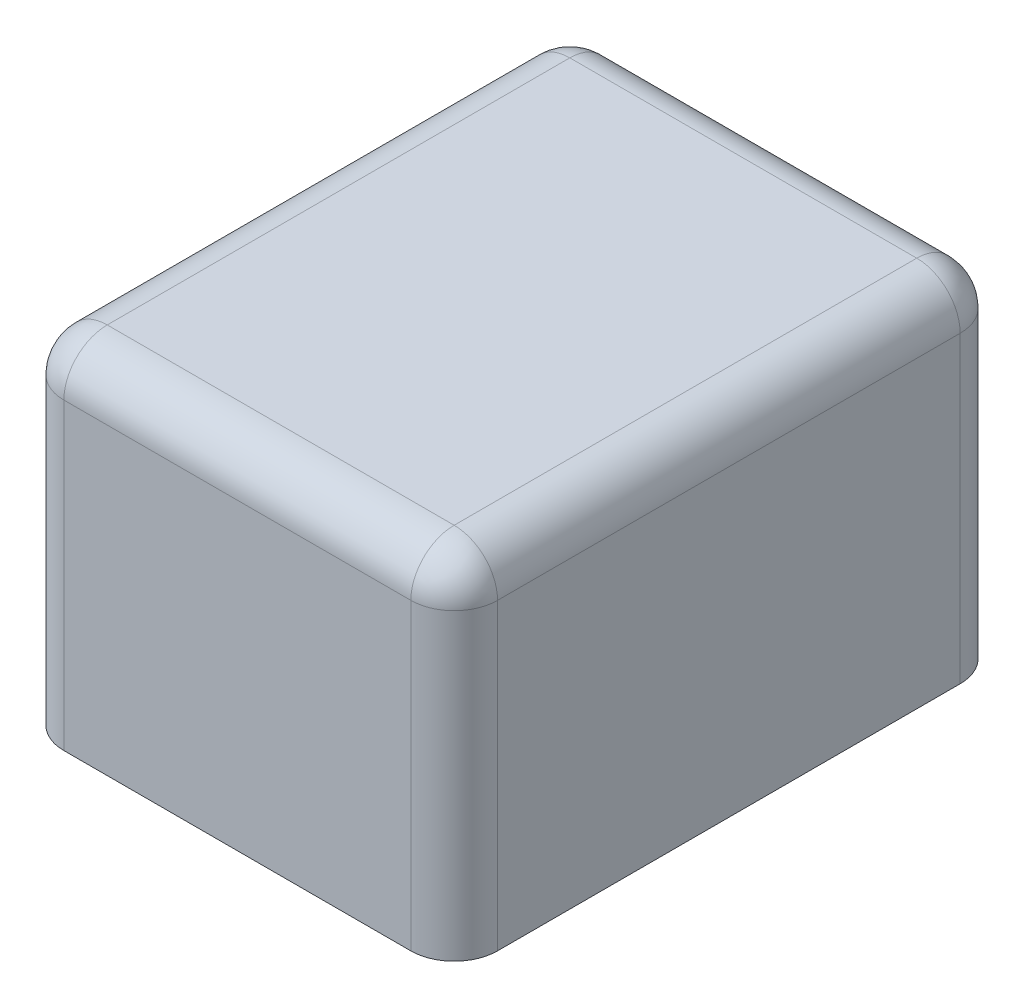
ISO-10303-21;
HEADER;
FILE_DESCRIPTION(('STEP AP214'),'2;1');
FILE_NAME('part.step','',(''),(''),'','','');
FILE_SCHEMA(('AUTOMOTIVE_DESIGN { 1 0 10303 214 1 1 1 1 }'));
ENDSEC;
DATA;
#1=APPLICATION_CONTEXT('core data for automotive mechanical design processes');
#2=APPLICATION_PROTOCOL_DEFINITION('international standard','automotive_design',2000,#1);
#3=PRODUCT_CONTEXT('',#1,'mechanical');
#4=PRODUCT('Part','Part','',(#3));
#5=PRODUCT_RELATED_PRODUCT_CATEGORY('part','',(#4));
#6=PRODUCT_DEFINITION_FORMATION('','',#4);
#7=PRODUCT_DEFINITION_CONTEXT('part definition',#1,'design');
#8=PRODUCT_DEFINITION('design','',#6,#7);
#9=PRODUCT_DEFINITION_SHAPE('','',#8);
#10=(LENGTH_UNIT() NAMED_UNIT(*) SI_UNIT(.MILLI.,.METRE.));
#11=(NAMED_UNIT(*) PLANE_ANGLE_UNIT() SI_UNIT($,.RADIAN.));
#12=(NAMED_UNIT(*) SI_UNIT($,.STERADIAN.) SOLID_ANGLE_UNIT());
#13=UNCERTAINTY_MEASURE_WITH_UNIT(LENGTH_MEASURE(1.E-05),#10,'distance_accuracy_value','');
#14=(GEOMETRIC_REPRESENTATION_CONTEXT(3) GLOBAL_UNCERTAINTY_ASSIGNED_CONTEXT((#13)) GLOBAL_UNIT_ASSIGNED_CONTEXT((#10,
#11,#12)) REPRESENTATION_CONTEXT('',''));
#15=CARTESIAN_POINT('',(0.,0.,0.));
#16=DIRECTION('',(0.,0.,1.));
#17=DIRECTION('',(1.,0.,0.));
#18=AXIS2_PLACEMENT_3D('',#15,#16,#17);
#19=CARTESIAN_POINT('',(0.,10.,0.));
#20=DIRECTION('',(1.,0.,0.));
#21=DIRECTION('',(0.,0.,-1.));
#22=AXIS2_PLACEMENT_3D('',#19,#20,#21);
#23=PLANE('',#22);
#24=DIRECTION('',(0.,0.,1.));
#25=VECTOR('',#24,1.);
#26=CARTESIAN_POINT('',(0.,0.,0.));
#27=LINE('',#26,#25);
#28=CARTESIAN_POINT('',(0.,0.,-17.5));
#29=VERTEX_POINT('',#28);
#30=CARTESIAN_POINT('',(0.,0.,-1.5));
#31=VERTEX_POINT('',#30);
#32=EDGE_CURVE('E198',#29,#31,#27,.T.);
#33=ORIENTED_EDGE('',*,*,#32,.T.);
#34=DIRECTION('',(0.,-1.,0.));
#35=VECTOR('',#34,1.);
#36=CARTESIAN_POINT('',(0.,10.,-1.5));
#37=LINE('',#36,#35);
#38=CARTESIAN_POINT('',(0.,10.5,-1.5));
#39=VERTEX_POINT('',#38);
#40=EDGE_CURVE('E11',#31,#39,#37,.F.);
#41=ORIENTED_EDGE('',*,*,#40,.T.);
#42=DIRECTION('',(0.,0.,1.));
#43=VECTOR('',#42,1.);
#44=CARTESIAN_POINT('',(0.,10.5,-19.));
#45=LINE('',#44,#43);
#46=CARTESIAN_POINT('',(0.,10.5,-17.5));
#47=VERTEX_POINT('',#46);
#48=EDGE_CURVE('E139',#39,#47,#45,.F.);
#49=ORIENTED_EDGE('',*,*,#48,.T.);
#50=DIRECTION('',(0.,-1.,0.));
#51=VECTOR('',#50,1.);
#52=CARTESIAN_POINT('',(0.,10.,-17.5));
#53=LINE('',#52,#51);
#54=EDGE_CURVE('E45',#47,#29,#53,.T.);
#55=ORIENTED_EDGE('',*,*,#54,.T.);
#56=EDGE_LOOP('',(#33,#41,#49,#55));
#57=FACE_BOUND('',#56,.T.);
#58=ADVANCED_FACE('F36',(#57),#23,.F.);
#59=CARTESIAN_POINT('',(0.,10.,0.));
#60=DIRECTION('',(0.,0.,-1.));
#61=DIRECTION('',(-1.,0.,0.));
#62=AXIS2_PLACEMENT_3D('',#59,#60,#61);
#63=PLANE('',#62);
#64=DIRECTION('',(1.,0.,0.));
#65=VECTOR('',#64,1.);
#66=CARTESIAN_POINT('',(0.,0.,0.));
#67=LINE('',#66,#65);
#68=CARTESIAN_POINT('',(1.5,0.,0.));
#69=VERTEX_POINT('',#68);
#70=CARTESIAN_POINT('',(13.5,0.,0.));
#71=VERTEX_POINT('',#70);
#72=EDGE_CURVE('E214',#69,#71,#67,.T.);
#73=ORIENTED_EDGE('',*,*,#72,.T.);
#74=DIRECTION('',(0.,-1.,0.));
#75=VECTOR('',#74,1.);
#76=CARTESIAN_POINT('',(13.5,10.,0.));
#77=LINE('',#76,#75);
#78=CARTESIAN_POINT('',(13.5,10.5,0.));
#79=VERTEX_POINT('',#78);
#80=EDGE_CURVE('E193',#71,#79,#77,.F.);
#81=ORIENTED_EDGE('',*,*,#80,.T.);
#82=DIRECTION('',(1.,0.,0.));
#83=VECTOR('',#82,1.);
#84=CARTESIAN_POINT('',(0.,10.5,0.));
#85=LINE('',#84,#83);
#86=CARTESIAN_POINT('',(1.5,10.5,0.));
#87=VERTEX_POINT('',#86);
#88=EDGE_CURVE('E164',#79,#87,#85,.F.);
#89=ORIENTED_EDGE('',*,*,#88,.T.);
#90=DIRECTION('',(0.,-1.,0.));
#91=VECTOR('',#90,1.);
#92=CARTESIAN_POINT('',(1.5,10.,0.));
#93=LINE('',#92,#91);
#94=EDGE_CURVE('E60',#87,#69,#93,.T.);
#95=ORIENTED_EDGE('',*,*,#94,.T.);
#96=EDGE_LOOP('',(#73,#81,#89,#95));
#97=FACE_BOUND('',#96,.T.);
#98=ADVANCED_FACE('F259',(#97),#63,.F.);
#99=CARTESIAN_POINT('',(15.,10.,0.));
#100=DIRECTION('',(-1.,0.,0.));
#101=DIRECTION('',(0.,0.,1.));
#102=AXIS2_PLACEMENT_3D('',#99,#100,#101);
#103=PLANE('',#102);
#104=DIRECTION('',(0.,0.,-1.));
#105=VECTOR('',#104,1.);
#106=CARTESIAN_POINT('',(15.,0.,0.));
#107=LINE('',#106,#105);
#108=CARTESIAN_POINT('',(15.,0.,-1.5));
#109=VERTEX_POINT('',#108);
#110=CARTESIAN_POINT('',(15.,0.,-17.5));
#111=VERTEX_POINT('',#110);
#112=EDGE_CURVE('E218',#109,#111,#107,.T.);
#113=ORIENTED_EDGE('',*,*,#112,.T.);
#114=DIRECTION('',(0.,-1.,0.));
#115=VECTOR('',#114,1.);
#116=CARTESIAN_POINT('',(15.,10.,-17.5));
#117=LINE('',#116,#115);
#118=CARTESIAN_POINT('',(15.,10.5,-17.5));
#119=VERTEX_POINT('',#118);
#120=EDGE_CURVE('E190',#111,#119,#117,.F.);
#121=ORIENTED_EDGE('',*,*,#120,.T.);
#122=DIRECTION('',(0.,0.,-1.));
#123=VECTOR('',#122,1.);
#124=CARTESIAN_POINT('',(15.,10.5,0.));
#125=LINE('',#124,#123);
#126=CARTESIAN_POINT('',(15.,10.5,-1.5));
#127=VERTEX_POINT('',#126);
#128=EDGE_CURVE('E157',#119,#127,#125,.F.);
#129=ORIENTED_EDGE('',*,*,#128,.T.);
#130=DIRECTION('',(0.,-1.,0.));
#131=VECTOR('',#130,1.);
#132=CARTESIAN_POINT('',(15.,10.,-1.5));
#133=LINE('',#132,#131);
#134=EDGE_CURVE('E188',#127,#109,#133,.T.);
#135=ORIENTED_EDGE('',*,*,#134,.T.);
#136=EDGE_LOOP('',(#113,#121,#129,#135));
#137=FACE_BOUND('',#136,.T.);
#138=ADVANCED_FACE('F239',(#137),#103,.F.);
#139=CARTESIAN_POINT('',(0.,10.,-19.));
#140=DIRECTION('',(0.,0.,1.));
#141=DIRECTION('',(1.,0.,0.));
#142=AXIS2_PLACEMENT_3D('',#139,#140,#141);
#143=PLANE('',#142);
#144=DIRECTION('',(-1.,0.,0.));
#145=VECTOR('',#144,1.);
#146=CARTESIAN_POINT('',(15.,10.5,-19.));
#147=LINE('',#146,#145);
#148=CARTESIAN_POINT('',(1.5,10.5,-19.));
#149=VERTEX_POINT('',#148);
#150=CARTESIAN_POINT('',(13.5,10.5,-19.));
#151=VERTEX_POINT('',#150);
#152=EDGE_CURVE('E137',#149,#151,#147,.F.);
#153=ORIENTED_EDGE('',*,*,#152,.T.);
#154=DIRECTION('',(0.,-1.,0.));
#155=VECTOR('',#154,1.);
#156=CARTESIAN_POINT('',(13.5,10.,-19.));
#157=LINE('',#156,#155);
#158=CARTESIAN_POINT('',(13.5,0.,-19.));
#159=VERTEX_POINT('',#158);
#160=EDGE_CURVE('E179',#151,#159,#157,.T.);
#161=ORIENTED_EDGE('',*,*,#160,.T.);
#162=DIRECTION('',(-1.,0.,0.));
#163=VECTOR('',#162,1.);
#164=CARTESIAN_POINT('',(0.,0.,-19.));
#165=LINE('',#164,#163);
#166=CARTESIAN_POINT('',(1.5,0.,-19.));
#167=VERTEX_POINT('',#166);
#168=EDGE_CURVE('E150',#159,#167,#165,.T.);
#169=ORIENTED_EDGE('',*,*,#168,.T.);
#170=DIRECTION('',(0.,-1.,0.));
#171=VECTOR('',#170,1.);
#172=CARTESIAN_POINT('',(1.5,10.,-19.));
#173=LINE('',#172,#171);
#174=EDGE_CURVE('E177',#167,#149,#173,.F.);
#175=ORIENTED_EDGE('',*,*,#174,.T.);
#176=EDGE_LOOP('',(#153,#161,#169,#175));
#177=FACE_BOUND('',#176,.T.);
#178=ADVANCED_FACE('F249',(#177),#143,.F.);
#179=CARTESIAN_POINT('',(0.,0.,0.));
#180=DIRECTION('',(0.,-1.,0.));
#181=DIRECTION('',(0.,0.,-1.));
#182=AXIS2_PLACEMENT_3D('',#179,#180,#181);
#183=PLANE('',#182);
#184=ORIENTED_EDGE('',*,*,#168,.F.);
#185=CARTESIAN_POINT('',(13.5,0.,-17.5));
#186=DIRECTION('',(0.,-1.,0.));
#187=DIRECTION('',(0.,0.,-1.));
#188=AXIS2_PLACEMENT_3D('',#185,#186,#187);
#189=CIRCLE('',#188,1.5);
#190=EDGE_CURVE('E186',#159,#111,#189,.T.);
#191=ORIENTED_EDGE('',*,*,#190,.T.);
#192=ORIENTED_EDGE('',*,*,#112,.F.);
#193=CARTESIAN_POINT('',(13.5,0.,-1.5));
#194=DIRECTION('',(0.,-1.,0.));
#195=DIRECTION('',(0.,0.,-1.));
#196=AXIS2_PLACEMENT_3D('',#193,#194,#195);
#197=CIRCLE('',#196,1.5);
#198=EDGE_CURVE('E53',#109,#71,#197,.T.);
#199=ORIENTED_EDGE('',*,*,#198,.T.);
#200=ORIENTED_EDGE('',*,*,#72,.F.);
#201=CARTESIAN_POINT('',(1.5,0.,-1.5));
#202=DIRECTION('',(0.,-1.,0.));
#203=DIRECTION('',(0.,0.,-1.));
#204=AXIS2_PLACEMENT_3D('',#201,#202,#203);
#205=CIRCLE('',#204,1.5);
#206=EDGE_CURVE('E183',#69,#31,#205,.T.);
#207=ORIENTED_EDGE('',*,*,#206,.T.);
#208=ORIENTED_EDGE('',*,*,#32,.F.);
#209=CARTESIAN_POINT('',(1.5,0.,-17.5));
#210=DIRECTION('',(0.,-1.,0.));
#211=DIRECTION('',(0.,0.,-1.));
#212=AXIS2_PLACEMENT_3D('',#209,#210,#211);
#213=CIRCLE('',#212,1.5);
#214=EDGE_CURVE('E181',#29,#167,#213,.T.);
#215=ORIENTED_EDGE('',*,*,#214,.T.);
#216=EDGE_LOOP('',(#184,#191,#192,#199,#200,#207,#208,#215));
#217=FACE_BOUND('',#216,.T.);
#218=ADVANCED_FACE('F212',(#217),#183,.T.);
#219=CARTESIAN_POINT('',(0.,12.,0.));
#220=DIRECTION('',(0.,1.,0.));
#221=DIRECTION('',(0.,0.,1.));
#222=AXIS2_PLACEMENT_3D('',#219,#220,#221);
#223=PLANE('',#222);
#224=DIRECTION('',(0.,0.,-1.));
#225=VECTOR('',#224,1.);
#226=CARTESIAN_POINT('',(13.5,12.,-19.));
#227=LINE('',#226,#225);
#228=CARTESIAN_POINT('',(13.5,12.,-1.5));
#229=VERTEX_POINT('',#228);
#230=CARTESIAN_POINT('',(13.5,12.,-17.5));
#231=VERTEX_POINT('',#230);
#232=EDGE_CURVE('E155',#229,#231,#227,.T.);
#233=ORIENTED_EDGE('',*,*,#232,.T.);
#234=DIRECTION('',(-1.,0.,0.));
#235=VECTOR('',#234,1.);
#236=CARTESIAN_POINT('',(0.,12.,-17.5));
#237=LINE('',#236,#235);
#238=CARTESIAN_POINT('',(1.5,12.,-17.5));
#239=VERTEX_POINT('',#238);
#240=EDGE_CURVE('E134',#231,#239,#237,.T.);
#241=ORIENTED_EDGE('',*,*,#240,.T.);
#242=DIRECTION('',(0.,0.,1.));
#243=VECTOR('',#242,1.);
#244=CARTESIAN_POINT('',(1.5,12.,0.));
#245=LINE('',#244,#243);
#246=CARTESIAN_POINT('',(1.5,12.,-1.5));
#247=VERTEX_POINT('',#246);
#248=EDGE_CURVE('E143',#239,#247,#245,.T.);
#249=ORIENTED_EDGE('',*,*,#248,.T.);
#250=DIRECTION('',(1.,0.,0.));
#251=VECTOR('',#250,1.);
#252=CARTESIAN_POINT('',(15.,12.,-1.5));
#253=LINE('',#252,#251);
#254=EDGE_CURVE('E149',#247,#229,#253,.T.);
#255=ORIENTED_EDGE('',*,*,#254,.T.);
#256=EDGE_LOOP('',(#233,#241,#249,#255));
#257=FACE_BOUND('',#256,.T.);
#258=ADVANCED_FACE('F153',(#257),#223,.T.);
#259=CARTESIAN_POINT('',(0.,10.5,-1.5));
#260=DIRECTION('',(-1.,0.,0.));
#261=DIRECTION('',(0.,0.,1.));
#262=AXIS2_PLACEMENT_3D('',#259,#260,#261);
#263=CYLINDRICAL_SURFACE('',#262,1.5);
#264=ORIENTED_EDGE('',*,*,#88,.F.);
#265=CARTESIAN_POINT('',(13.5,10.5,-1.5));
#266=DIRECTION('',(-1.,0.,0.));
#267=DIRECTION('',(0.,0.,1.));
#268=AXIS2_PLACEMENT_3D('',#265,#266,#267);
#269=CIRCLE('',#268,1.5);
#270=EDGE_CURVE('E126',#79,#229,#269,.T.);
#271=ORIENTED_EDGE('',*,*,#270,.T.);
#272=ORIENTED_EDGE('',*,*,#254,.F.);
#273=CARTESIAN_POINT('',(1.5,10.5,-1.5));
#274=DIRECTION('',(-1.,0.,0.));
#275=DIRECTION('',(0.,0.,1.));
#276=AXIS2_PLACEMENT_3D('',#273,#274,#275);
#277=CIRCLE('',#276,1.5);
#278=EDGE_CURVE('E173',#247,#87,#277,.F.);
#279=ORIENTED_EDGE('',*,*,#278,.T.);
#280=EDGE_LOOP('',(#264,#271,#272,#279));
#281=FACE_BOUND('',#280,.T.);
#282=ADVANCED_FACE('F273',(#281),#263,.T.);
#283=CARTESIAN_POINT('',(13.5,10.5,0.));
#284=DIRECTION('',(0.,0.,1.));
#285=DIRECTION('',(1.,0.,0.));
#286=AXIS2_PLACEMENT_3D('',#283,#284,#285);
#287=CYLINDRICAL_SURFACE('',#286,1.5);
#288=ORIENTED_EDGE('',*,*,#128,.F.);
#289=CARTESIAN_POINT('',(13.5,10.5,-17.5));
#290=DIRECTION('',(0.,0.,1.));
#291=DIRECTION('',(1.,0.,0.));
#292=AXIS2_PLACEMENT_3D('',#289,#290,#291);
#293=CIRCLE('',#292,1.5);
#294=EDGE_CURVE('E171',#119,#231,#293,.T.);
#295=ORIENTED_EDGE('',*,*,#294,.T.);
#296=ORIENTED_EDGE('',*,*,#232,.F.);
#297=CARTESIAN_POINT('',(13.5,10.5,-1.5));
#298=DIRECTION('',(0.,0.,1.));
#299=DIRECTION('',(1.,0.,0.));
#300=AXIS2_PLACEMENT_3D('',#297,#298,#299);
#301=CIRCLE('',#300,1.5);
#302=EDGE_CURVE('E168',#229,#127,#301,.F.);
#303=ORIENTED_EDGE('',*,*,#302,.T.);
#304=EDGE_LOOP('',(#288,#295,#296,#303));
#305=FACE_BOUND('',#304,.T.);
#306=ADVANCED_FACE('F228',(#305),#287,.T.);
#307=CARTESIAN_POINT('',(1.5,10.5,0.));
#308=DIRECTION('',(0.,0.,-1.));
#309=DIRECTION('',(-1.,0.,0.));
#310=AXIS2_PLACEMENT_3D('',#307,#308,#309);
#311=CYLINDRICAL_SURFACE('',#310,1.5);
#312=ORIENTED_EDGE('',*,*,#48,.F.);
#313=CARTESIAN_POINT('',(1.5,10.5,-1.5));
#314=DIRECTION('',(0.,0.,-1.));
#315=DIRECTION('',(-1.,0.,0.));
#316=AXIS2_PLACEMENT_3D('',#313,#314,#315);
#317=CIRCLE('',#316,1.5);
#318=EDGE_CURVE('E125',#39,#247,#317,.T.);
#319=ORIENTED_EDGE('',*,*,#318,.T.);
#320=ORIENTED_EDGE('',*,*,#248,.F.);
#321=CARTESIAN_POINT('',(1.5,10.5,-17.5));
#322=DIRECTION('',(0.,0.,-1.));
#323=DIRECTION('',(-1.,0.,0.));
#324=AXIS2_PLACEMENT_3D('',#321,#322,#323);
#325=CIRCLE('',#324,1.5);
#326=EDGE_CURVE('E116',#239,#47,#325,.F.);
#327=ORIENTED_EDGE('',*,*,#326,.T.);
#328=EDGE_LOOP('',(#312,#319,#320,#327));
#329=FACE_BOUND('',#328,.T.);
#330=ADVANCED_FACE('F144',(#329),#311,.T.);
#331=CARTESIAN_POINT('',(0.,10.5,-17.5));
#332=DIRECTION('',(1.,0.,0.));
#333=DIRECTION('',(0.,0.,-1.));
#334=AXIS2_PLACEMENT_3D('',#331,#332,#333);
#335=CYLINDRICAL_SURFACE('',#334,1.5);
#336=ORIENTED_EDGE('',*,*,#240,.F.);
#337=CARTESIAN_POINT('',(13.5,10.5,-17.5));
#338=DIRECTION('',(1.,0.,0.));
#339=DIRECTION('',(0.,0.,-1.));
#340=AXIS2_PLACEMENT_3D('',#337,#338,#339);
#341=CIRCLE('',#340,1.5);
#342=EDGE_CURVE('E138',#231,#151,#341,.F.);
#343=ORIENTED_EDGE('',*,*,#342,.T.);
#344=ORIENTED_EDGE('',*,*,#152,.F.);
#345=CARTESIAN_POINT('',(1.5,10.5,-17.5));
#346=DIRECTION('',(1.,0.,0.));
#347=DIRECTION('',(0.,0.,-1.));
#348=AXIS2_PLACEMENT_3D('',#345,#346,#347);
#349=CIRCLE('',#348,1.5);
#350=EDGE_CURVE('E119',#149,#239,#349,.T.);
#351=ORIENTED_EDGE('',*,*,#350,.T.);
#352=EDGE_LOOP('',(#336,#343,#344,#351));
#353=FACE_BOUND('',#352,.T.);
#354=ADVANCED_FACE('F131',(#353),#335,.T.);
#355=CARTESIAN_POINT('',(13.5,10.,-17.5));
#356=DIRECTION('',(0.,-1.,0.));
#357=DIRECTION('',(0.,0.,-1.));
#358=AXIS2_PLACEMENT_3D('',#355,#356,#357);
#359=CYLINDRICAL_SURFACE('',#358,1.5);
#360=ORIENTED_EDGE('',*,*,#190,.F.);
#361=ORIENTED_EDGE('',*,*,#160,.F.);
#362=CARTESIAN_POINT('',(13.5,10.5,-17.5));
#363=DIRECTION('',(0.,1.,0.));
#364=DIRECTION('',(0.,0.,1.));
#365=AXIS2_PLACEMENT_3D('',#362,#363,#364);
#366=CIRCLE('',#365,1.5);
#367=EDGE_CURVE('E196',#119,#151,#366,.T.);
#368=ORIENTED_EDGE('',*,*,#367,.F.);
#369=ORIENTED_EDGE('',*,*,#120,.F.);
#370=EDGE_LOOP('',(#360,#361,#368,#369));
#371=FACE_BOUND('',#370,.T.);
#372=ADVANCED_FACE('F244',(#371),#359,.T.);
#373=CARTESIAN_POINT('',(13.5,10.5,-17.5));
#374=DIRECTION('',(0.,0.,1.));
#375=DIRECTION('',(1.,0.,0.));
#376=AXIS2_PLACEMENT_3D('',#373,#374,#375);
#377=SPHERICAL_SURFACE('',#376,1.5);
#378=ORIENTED_EDGE('',*,*,#342,.F.);
#379=ORIENTED_EDGE('',*,*,#294,.F.);
#380=ORIENTED_EDGE('',*,*,#367,.T.);
#381=EDGE_LOOP('',(#378,#379,#380));
#382=FACE_BOUND('',#381,.T.);
#383=ADVANCED_FACE('F247',(#382),#377,.T.);
#384=CARTESIAN_POINT('',(13.5,10.,-1.5));
#385=DIRECTION('',(0.,-1.,0.));
#386=DIRECTION('',(0.,0.,-1.));
#387=AXIS2_PLACEMENT_3D('',#384,#385,#386);
#388=CYLINDRICAL_SURFACE('',#387,1.5);
#389=ORIENTED_EDGE('',*,*,#198,.F.);
#390=ORIENTED_EDGE('',*,*,#134,.F.);
#391=CARTESIAN_POINT('',(13.5,10.5,-1.5));
#392=DIRECTION('',(0.,1.,0.));
#393=DIRECTION('',(0.,0.,1.));
#394=AXIS2_PLACEMENT_3D('',#391,#392,#393);
#395=CIRCLE('',#394,1.5);
#396=EDGE_CURVE('E199',#79,#127,#395,.T.);
#397=ORIENTED_EDGE('',*,*,#396,.F.);
#398=ORIENTED_EDGE('',*,*,#80,.F.);
#399=EDGE_LOOP('',(#389,#390,#397,#398));
#400=FACE_BOUND('',#399,.T.);
#401=ADVANCED_FACE('F237',(#400),#388,.T.);
#402=CARTESIAN_POINT('',(13.5,10.5,-1.5));
#403=DIRECTION('',(0.,0.,1.));
#404=DIRECTION('',(1.,0.,0.));
#405=AXIS2_PLACEMENT_3D('',#402,#403,#404);
#406=SPHERICAL_SURFACE('',#405,1.5);
#407=ORIENTED_EDGE('',*,*,#302,.F.);
#408=ORIENTED_EDGE('',*,*,#270,.F.);
#409=ORIENTED_EDGE('',*,*,#396,.T.);
#410=EDGE_LOOP('',(#407,#408,#409));
#411=FACE_BOUND('',#410,.T.);
#412=ADVANCED_FACE('F232',(#411),#406,.T.);
#413=CARTESIAN_POINT('',(1.5,10.,-1.5));
#414=DIRECTION('',(0.,-1.,0.));
#415=DIRECTION('',(0.,0.,-1.));
#416=AXIS2_PLACEMENT_3D('',#413,#414,#415);
#417=CYLINDRICAL_SURFACE('',#416,1.5);
#418=ORIENTED_EDGE('',*,*,#206,.F.);
#419=ORIENTED_EDGE('',*,*,#94,.F.);
#420=CARTESIAN_POINT('',(1.5,10.5,-1.5));
#421=DIRECTION('',(0.,1.,0.));
#422=DIRECTION('',(0.,0.,1.));
#423=AXIS2_PLACEMENT_3D('',#420,#421,#422);
#424=CIRCLE('',#423,1.5);
#425=EDGE_CURVE('E200',#39,#87,#424,.T.);
#426=ORIENTED_EDGE('',*,*,#425,.F.);
#427=ORIENTED_EDGE('',*,*,#40,.F.);
#428=EDGE_LOOP('',(#418,#419,#426,#427));
#429=FACE_BOUND('',#428,.T.);
#430=ADVANCED_FACE('F208',(#429),#417,.T.);
#431=CARTESIAN_POINT('',(1.5,10.5,-1.5));
#432=DIRECTION('',(0.,0.,1.));
#433=DIRECTION('',(1.,0.,0.));
#434=AXIS2_PLACEMENT_3D('',#431,#432,#433);
#435=SPHERICAL_SURFACE('',#434,1.5);
#436=ORIENTED_EDGE('',*,*,#425,.T.);
#437=ORIENTED_EDGE('',*,*,#278,.F.);
#438=ORIENTED_EDGE('',*,*,#318,.F.);
#439=EDGE_LOOP('',(#436,#437,#438));
#440=FACE_BOUND('',#439,.T.);
#441=ADVANCED_FACE('F204',(#440),#435,.T.);
#442=CARTESIAN_POINT('',(1.5,10.,-17.5));
#443=DIRECTION('',(0.,-1.,0.));
#444=DIRECTION('',(0.,0.,-1.));
#445=AXIS2_PLACEMENT_3D('',#442,#443,#444);
#446=CYLINDRICAL_SURFACE('',#445,1.5);
#447=ORIENTED_EDGE('',*,*,#214,.F.);
#448=ORIENTED_EDGE('',*,*,#54,.F.);
#449=CARTESIAN_POINT('',(1.5,10.5,-17.5));
#450=DIRECTION('',(0.,1.,0.));
#451=DIRECTION('',(0.,0.,1.));
#452=AXIS2_PLACEMENT_3D('',#449,#450,#451);
#453=CIRCLE('',#452,1.5);
#454=EDGE_CURVE('E40',#149,#47,#453,.T.);
#455=ORIENTED_EDGE('',*,*,#454,.F.);
#456=ORIENTED_EDGE('',*,*,#174,.F.);
#457=EDGE_LOOP('',(#447,#448,#455,#456));
#458=FACE_BOUND('',#457,.T.);
#459=ADVANCED_FACE('F38',(#458),#446,.T.);
#460=CARTESIAN_POINT('',(1.5,10.5,-17.5));
#461=DIRECTION('',(0.,0.,1.));
#462=DIRECTION('',(1.,0.,0.));
#463=AXIS2_PLACEMENT_3D('',#460,#461,#462);
#464=SPHERICAL_SURFACE('',#463,1.5);
#465=ORIENTED_EDGE('',*,*,#454,.T.);
#466=ORIENTED_EDGE('',*,*,#326,.F.);
#467=ORIENTED_EDGE('',*,*,#350,.F.);
#468=EDGE_LOOP('',(#465,#466,#467));
#469=FACE_BOUND('',#468,.T.);
#470=ADVANCED_FACE('F118',(#469),#464,.T.);
#471=CLOSED_SHELL('',(#58,#98,#138,#178,#218,#258,#282,#306,#330,#354,#372,#383,#401,#412,#430,
#441,#459,#470));
#472=MANIFOLD_SOLID_BREP('B2',#471);
#473=ADVANCED_BREP_SHAPE_REPRESENTATION('',(#18,#472),#14);
#474=SHAPE_DEFINITION_REPRESENTATION(#9,#473);
ENDSEC;
END-ISO-10303-21;
